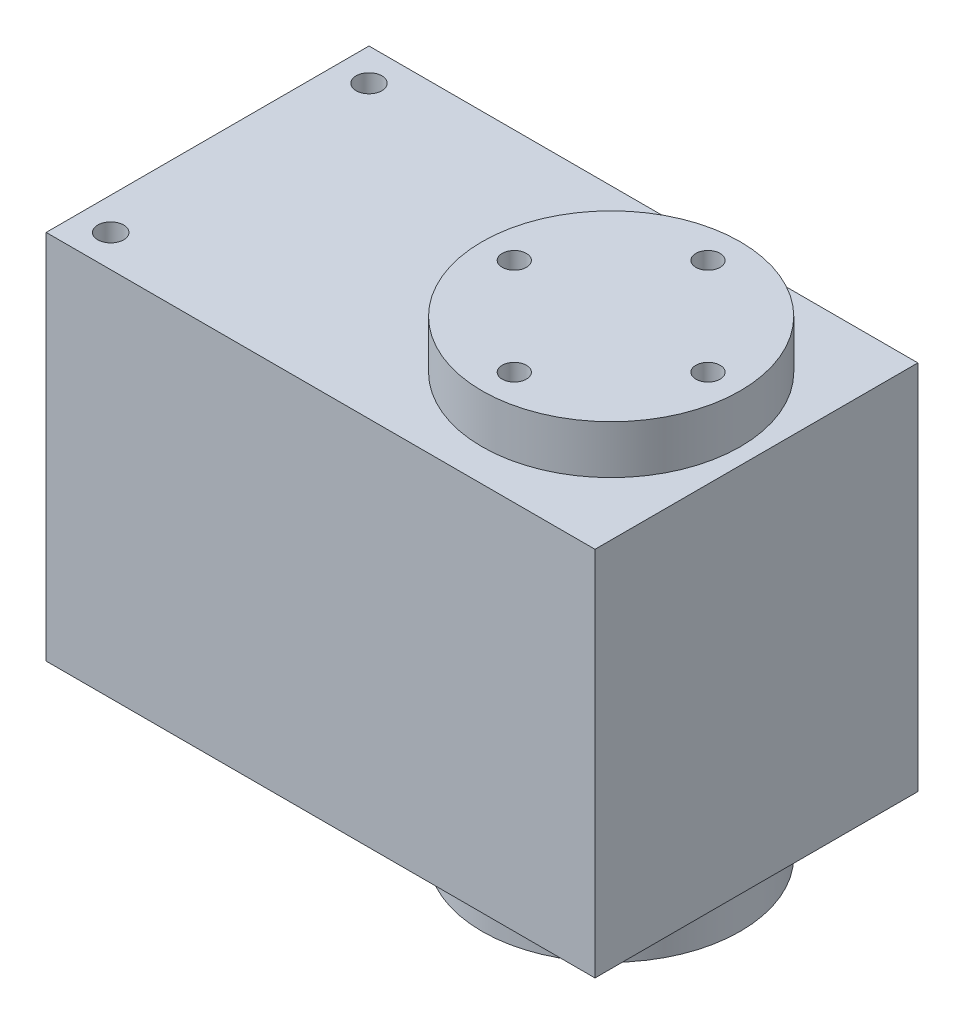
ISO-10303-21;
HEADER;
FILE_DESCRIPTION(('STEP AP214'),'2;1');
FILE_NAME('part.step','',(''),(''),'','','');
FILE_SCHEMA(('AUTOMOTIVE_DESIGN { 1 0 10303 214 1 1 1 1 }'));
ENDSEC;
DATA;
#1=APPLICATION_CONTEXT('core data for automotive mechanical design processes');
#2=APPLICATION_PROTOCOL_DEFINITION('international standard','automotive_design',2000,#1);
#3=PRODUCT_CONTEXT('',#1,'mechanical');
#4=PRODUCT('Part','Part','',(#3));
#5=PRODUCT_RELATED_PRODUCT_CATEGORY('part','',(#4));
#6=PRODUCT_DEFINITION_FORMATION('','',#4);
#7=PRODUCT_DEFINITION_CONTEXT('part definition',#1,'design');
#8=PRODUCT_DEFINITION('design','',#6,#7);
#9=PRODUCT_DEFINITION_SHAPE('','',#8);
#10=(LENGTH_UNIT() NAMED_UNIT(*) SI_UNIT(.MILLI.,.METRE.));
#11=(NAMED_UNIT(*) PLANE_ANGLE_UNIT() SI_UNIT($,.RADIAN.));
#12=(NAMED_UNIT(*) SI_UNIT($,.STERADIAN.) SOLID_ANGLE_UNIT());
#13=UNCERTAINTY_MEASURE_WITH_UNIT(LENGTH_MEASURE(1.E-05),#10,'distance_accuracy_value','');
#14=(GEOMETRIC_REPRESENTATION_CONTEXT(3) GLOBAL_UNCERTAINTY_ASSIGNED_CONTEXT((#13)) GLOBAL_UNIT_ASSIGNED_CONTEXT((#10,
#11,#12)) REPRESENTATION_CONTEXT('',''));
#15=CARTESIAN_POINT('',(0.,0.,0.));
#16=DIRECTION('',(0.,0.,1.));
#17=DIRECTION('',(1.,0.,0.));
#18=AXIS2_PLACEMENT_3D('',#15,#16,#17);
#19=CARTESIAN_POINT('',(34.,11.5,10.));
#20=DIRECTION('',(0.,-1.,0.));
#21=DIRECTION('',(0.,0.,-1.));
#22=AXIS2_PLACEMENT_3D('',#19,#20,#21);
#23=PLANE('',#22);
#24=CARTESIAN_POINT('',(25.,11.5,0.));
#25=DIRECTION('',(0.,-1.,0.));
#26=DIRECTION('',(0.,0.,-1.));
#27=AXIS2_PLACEMENT_3D('',#24,#25,#26);
#28=CIRCLE('',#27,8.);
#29=CARTESIAN_POINT('',(25.,11.5,-8.));
#30=VERTEX_POINT('',#29);
#31=EDGE_CURVE('E11',#30,#30,#28,.F.);
#32=ORIENTED_EDGE('',*,*,#31,.F.);
#33=EDGE_LOOP('',(#32));
#34=FACE_BOUND('',#33,.T.);
#35=CARTESIAN_POINT('',(2.,11.5,-8.));
#36=DIRECTION('',(0.,-1.,0.));
#37=DIRECTION('',(0.,0.,-1.));
#38=AXIS2_PLACEMENT_3D('',#35,#36,#37);
#39=CIRCLE('',#38,0.8);
#40=CARTESIAN_POINT('',(2.,11.5,-8.8));
#41=VERTEX_POINT('',#40);
#42=EDGE_CURVE('E117',#41,#41,#39,.T.);
#43=ORIENTED_EDGE('',*,*,#42,.T.);
#44=EDGE_LOOP('',(#43));
#45=FACE_BOUND('',#44,.T.);
#46=DIRECTION('',(0.,0.,1.));
#47=VECTOR('',#46,1.);
#48=CARTESIAN_POINT('',(0.,11.5,10.));
#49=LINE('',#48,#47);
#50=CARTESIAN_POINT('',(0.,11.5,-9.99999999999999));
#51=VERTEX_POINT('',#50);
#52=CARTESIAN_POINT('',(0.,11.5,10.));
#53=VERTEX_POINT('',#52);
#54=EDGE_CURVE('E96',#51,#53,#49,.T.);
#55=ORIENTED_EDGE('',*,*,#54,.T.);
#56=DIRECTION('',(-1.,0.,0.));
#57=VECTOR('',#56,1.);
#58=CARTESIAN_POINT('',(34.,11.5,10.));
#59=LINE('',#58,#57);
#60=CARTESIAN_POINT('',(34.,11.5,10.));
#61=VERTEX_POINT('',#60);
#62=EDGE_CURVE('E94',#61,#53,#59,.T.);
#63=ORIENTED_EDGE('',*,*,#62,.F.);
#64=DIRECTION('',(0.,0.,1.));
#65=VECTOR('',#64,1.);
#66=CARTESIAN_POINT('',(34.,11.5,10.));
#67=LINE('',#66,#65);
#68=CARTESIAN_POINT('',(34.,11.5,-9.99999999999999));
#69=VERTEX_POINT('',#68);
#70=EDGE_CURVE('E86',#69,#61,#67,.T.);
#71=ORIENTED_EDGE('',*,*,#70,.F.);
#72=DIRECTION('',(-1.,0.,0.));
#73=VECTOR('',#72,1.);
#74=CARTESIAN_POINT('',(34.,11.5,-9.99999999999999));
#75=LINE('',#74,#73);
#76=EDGE_CURVE('E47',#69,#51,#75,.T.);
#77=ORIENTED_EDGE('',*,*,#76,.T.);
#78=EDGE_LOOP('',(#55,#63,#71,#77));
#79=FACE_BOUND('',#78,.T.);
#80=CARTESIAN_POINT('',(2.,11.5,8.));
#81=DIRECTION('',(0.,-1.,0.));
#82=DIRECTION('',(0.,0.,-1.));
#83=AXIS2_PLACEMENT_3D('',#80,#81,#82);
#84=CIRCLE('',#83,0.8);
#85=CARTESIAN_POINT('',(2.,11.5,7.2));
#86=VERTEX_POINT('',#85);
#87=EDGE_CURVE('E108',#86,#86,#84,.F.);
#88=ORIENTED_EDGE('',*,*,#87,.F.);
#89=EDGE_LOOP('',(#88));
#90=FACE_BOUND('',#89,.T.);
#91=ADVANCED_FACE('F38',(#34,#45,#79,#90),#23,.F.);
#92=CARTESIAN_POINT('',(34.,-11.5,10.));
#93=DIRECTION('',(0.,1.,0.));
#94=DIRECTION('',(0.,0.,1.));
#95=AXIS2_PLACEMENT_3D('',#92,#93,#94);
#96=PLANE('',#95);
#97=CARTESIAN_POINT('',(25.,-11.5,0.));
#98=DIRECTION('',(0.,1.,0.));
#99=DIRECTION('',(0.,0.,1.));
#100=AXIS2_PLACEMENT_3D('',#97,#98,#99);
#101=CIRCLE('',#100,8.);
#102=CARTESIAN_POINT('',(25.,-11.5,8.));
#103=VERTEX_POINT('',#102);
#104=EDGE_CURVE('E133',#103,#103,#101,.T.);
#105=ORIENTED_EDGE('',*,*,#104,.T.);
#106=EDGE_LOOP('',(#105));
#107=FACE_BOUND('',#106,.T.);
#108=CARTESIAN_POINT('',(2.,-11.5,-8.));
#109=DIRECTION('',(0.,1.,0.));
#110=DIRECTION('',(0.,0.,1.));
#111=AXIS2_PLACEMENT_3D('',#108,#109,#110);
#112=CIRCLE('',#111,0.8);
#113=CARTESIAN_POINT('',(2.,-11.5,-7.2));
#114=VERTEX_POINT('',#113);
#115=EDGE_CURVE('E115',#114,#114,#112,.T.);
#116=ORIENTED_EDGE('',*,*,#115,.T.);
#117=EDGE_LOOP('',(#116));
#118=FACE_BOUND('',#117,.T.);
#119=DIRECTION('',(0.,0.,-1.));
#120=VECTOR('',#119,1.);
#121=CARTESIAN_POINT('',(0.,-11.5,10.));
#122=LINE('',#121,#120);
#123=CARTESIAN_POINT('',(0.,-11.5,10.));
#124=VERTEX_POINT('',#123);
#125=CARTESIAN_POINT('',(0.,-11.5,-10.));
#126=VERTEX_POINT('',#125);
#127=EDGE_CURVE('E78',#124,#126,#122,.T.);
#128=ORIENTED_EDGE('',*,*,#127,.T.);
#129=DIRECTION('',(-1.,0.,0.));
#130=VECTOR('',#129,1.);
#131=CARTESIAN_POINT('',(34.,-11.5,-10.));
#132=LINE('',#131,#130);
#133=CARTESIAN_POINT('',(34.,-11.5,-10.));
#134=VERTEX_POINT('',#133);
#135=EDGE_CURVE('E101',#134,#126,#132,.T.);
#136=ORIENTED_EDGE('',*,*,#135,.F.);
#137=DIRECTION('',(0.,0.,-1.));
#138=VECTOR('',#137,1.);
#139=CARTESIAN_POINT('',(34.,-11.5,10.));
#140=LINE('',#139,#138);
#141=CARTESIAN_POINT('',(34.,-11.5,10.));
#142=VERTEX_POINT('',#141);
#143=EDGE_CURVE('E55',#142,#134,#140,.T.);
#144=ORIENTED_EDGE('',*,*,#143,.F.);
#145=DIRECTION('',(-1.,0.,0.));
#146=VECTOR('',#145,1.);
#147=CARTESIAN_POINT('',(34.,-11.5,10.));
#148=LINE('',#147,#146);
#149=EDGE_CURVE('E97',#142,#124,#148,.T.);
#150=ORIENTED_EDGE('',*,*,#149,.T.);
#151=EDGE_LOOP('',(#128,#136,#144,#150));
#152=FACE_BOUND('',#151,.T.);
#153=CARTESIAN_POINT('',(2.,-11.5,8.));
#154=DIRECTION('',(0.,1.,0.));
#155=DIRECTION('',(0.,0.,1.));
#156=AXIS2_PLACEMENT_3D('',#153,#154,#155);
#157=CIRCLE('',#156,0.8);
#158=CARTESIAN_POINT('',(2.,-11.5,8.8));
#159=VERTEX_POINT('',#158);
#160=EDGE_CURVE('E119',#159,#159,#157,.F.);
#161=ORIENTED_EDGE('',*,*,#160,.F.);
#162=EDGE_LOOP('',(#161));
#163=FACE_BOUND('',#162,.T.);
#164=ADVANCED_FACE('F204',(#107,#118,#152,#163),#96,.F.);
#165=CARTESIAN_POINT('',(34.,11.5,-9.99999999999999));
#166=DIRECTION('',(0.,0.,1.));
#167=DIRECTION('',(0.,-1.,0.));
#168=AXIS2_PLACEMENT_3D('',#165,#166,#167);
#169=PLANE('',#168);
#170=DIRECTION('',(0.,1.,0.));
#171=VECTOR('',#170,1.);
#172=CARTESIAN_POINT('',(0.,11.5,-9.99999999999999));
#173=LINE('',#172,#171);
#174=EDGE_CURVE('E105',#126,#51,#173,.T.);
#175=ORIENTED_EDGE('',*,*,#174,.T.);
#176=ORIENTED_EDGE('',*,*,#76,.F.);
#177=DIRECTION('',(0.,1.,0.));
#178=VECTOR('',#177,1.);
#179=CARTESIAN_POINT('',(34.,11.5,-9.99999999999999));
#180=LINE('',#179,#178);
#181=EDGE_CURVE('E91',#134,#69,#180,.T.);
#182=ORIENTED_EDGE('',*,*,#181,.F.);
#183=ORIENTED_EDGE('',*,*,#135,.T.);
#184=EDGE_LOOP('',(#175,#176,#182,#183));
#185=FACE_BOUND('',#184,.T.);
#186=ADVANCED_FACE('F40',(#185),#169,.F.);
#187=CARTESIAN_POINT('',(34.,11.5,10.));
#188=DIRECTION('',(0.,0.,-1.));
#189=DIRECTION('',(0.,1.,0.));
#190=AXIS2_PLACEMENT_3D('',#187,#188,#189);
#191=PLANE('',#190);
#192=DIRECTION('',(0.,-1.,0.));
#193=VECTOR('',#192,1.);
#194=CARTESIAN_POINT('',(0.,11.5,10.));
#195=LINE('',#194,#193);
#196=EDGE_CURVE('E72',#53,#124,#195,.T.);
#197=ORIENTED_EDGE('',*,*,#196,.T.);
#198=ORIENTED_EDGE('',*,*,#149,.F.);
#199=DIRECTION('',(0.,-1.,0.));
#200=VECTOR('',#199,1.);
#201=CARTESIAN_POINT('',(34.,11.5,10.));
#202=LINE('',#201,#200);
#203=EDGE_CURVE('E89',#61,#142,#202,.T.);
#204=ORIENTED_EDGE('',*,*,#203,.F.);
#205=ORIENTED_EDGE('',*,*,#62,.T.);
#206=EDGE_LOOP('',(#197,#198,#204,#205));
#207=FACE_BOUND('',#206,.T.);
#208=ADVANCED_FACE('F99',(#207),#191,.F.);
#209=CARTESIAN_POINT('',(34.,0.,0.));
#210=DIRECTION('',(1.,0.,0.));
#211=DIRECTION('',(0.,0.,-1.));
#212=AXIS2_PLACEMENT_3D('',#209,#210,#211);
#213=PLANE('',#212);
#214=ORIENTED_EDGE('',*,*,#181,.T.);
#215=ORIENTED_EDGE('',*,*,#70,.T.);
#216=ORIENTED_EDGE('',*,*,#203,.T.);
#217=ORIENTED_EDGE('',*,*,#143,.T.);
#218=EDGE_LOOP('',(#214,#215,#216,#217));
#219=FACE_BOUND('',#218,.T.);
#220=ADVANCED_FACE('F87',(#219),#213,.T.);
#221=CARTESIAN_POINT('',(0.,0.,0.));
#222=DIRECTION('',(1.,0.,0.));
#223=DIRECTION('',(0.,0.,-1.));
#224=AXIS2_PLACEMENT_3D('',#221,#222,#223);
#225=PLANE('',#224);
#226=ORIENTED_EDGE('',*,*,#174,.F.);
#227=ORIENTED_EDGE('',*,*,#127,.F.);
#228=ORIENTED_EDGE('',*,*,#196,.F.);
#229=ORIENTED_EDGE('',*,*,#54,.F.);
#230=EDGE_LOOP('',(#226,#227,#228,#229));
#231=FACE_BOUND('',#230,.T.);
#232=ADVANCED_FACE('F215',(#231),#225,.F.);
#233=CARTESIAN_POINT('',(2.,-21.5,-8.));
#234=DIRECTION('',(0.,1.,0.));
#235=DIRECTION('',(0.,0.,1.));
#236=AXIS2_PLACEMENT_3D('',#233,#234,#235);
#237=CYLINDRICAL_SURFACE('',#236,0.8);
#238=ORIENTED_EDGE('',*,*,#115,.F.);
#239=EDGE_LOOP('',(#238));
#240=FACE_BOUND('',#239,.T.);
#241=ORIENTED_EDGE('',*,*,#42,.F.);
#242=EDGE_LOOP('',(#241));
#243=FACE_BOUND('',#242,.T.);
#244=ADVANCED_FACE('F218',(#240,#243),#237,.F.);
#245=CARTESIAN_POINT('',(2.,-21.5,8.));
#246=DIRECTION('',(0.,1.,0.));
#247=DIRECTION('',(0.,0.,1.));
#248=AXIS2_PLACEMENT_3D('',#245,#246,#247);
#249=CYLINDRICAL_SURFACE('',#248,0.8);
#250=ORIENTED_EDGE('',*,*,#160,.T.);
#251=EDGE_LOOP('',(#250));
#252=FACE_BOUND('',#251,.T.);
#253=ORIENTED_EDGE('',*,*,#87,.T.);
#254=EDGE_LOOP('',(#253));
#255=FACE_BOUND('',#254,.T.);
#256=ADVANCED_FACE('F224',(#252,#255),#249,.F.);
#257=CARTESIAN_POINT('',(25.,14.5,0.));
#258=DIRECTION('',(0.,-1.,0.));
#259=DIRECTION('',(0.,0.,-1.));
#260=AXIS2_PLACEMENT_3D('',#257,#258,#259);
#261=CYLINDRICAL_SURFACE('',#260,8.);
#262=CARTESIAN_POINT('',(25.,14.5,0.));
#263=DIRECTION('',(0.,1.,0.));
#264=DIRECTION('',(0.,0.,1.));
#265=AXIS2_PLACEMENT_3D('',#262,#263,#264);
#266=CIRCLE('',#265,8.);
#267=CARTESIAN_POINT('',(25.,14.5,8.));
#268=VERTEX_POINT('',#267);
#269=EDGE_CURVE('E118',#268,#268,#266,.T.);
#270=ORIENTED_EDGE('',*,*,#269,.F.);
#271=EDGE_LOOP('',(#270));
#272=FACE_BOUND('',#271,.T.);
#273=ORIENTED_EDGE('',*,*,#31,.T.);
#274=EDGE_LOOP('',(#273));
#275=FACE_BOUND('',#274,.T.);
#276=ADVANCED_FACE('F228',(#272,#275),#261,.T.);
#277=CARTESIAN_POINT('',(0.,14.5,0.));
#278=DIRECTION('',(0.,1.,0.));
#279=DIRECTION('',(0.,0.,1.));
#280=AXIS2_PLACEMENT_3D('',#277,#278,#279);
#281=PLANE('',#280);
#282=CARTESIAN_POINT('',(31.,14.5,0.));
#283=DIRECTION('',(0.,1.,0.));
#284=DIRECTION('',(0.,0.,1.));
#285=AXIS2_PLACEMENT_3D('',#282,#283,#284);
#286=CIRCLE('',#285,0.750000000000002);
#287=CARTESIAN_POINT('',(31.,14.5,0.750000000000065));
#288=VERTEX_POINT('',#287);
#289=EDGE_CURVE('E151',#288,#288,#286,.T.);
#290=ORIENTED_EDGE('',*,*,#289,.F.);
#291=EDGE_LOOP('',(#290));
#292=FACE_BOUND('',#291,.T.);
#293=CARTESIAN_POINT('',(25.,14.5,-6.));
#294=DIRECTION('',(0.,1.,0.));
#295=DIRECTION('',(0.,0.,1.));
#296=AXIS2_PLACEMENT_3D('',#293,#294,#295);
#297=CIRCLE('',#296,0.750000000000001);
#298=CARTESIAN_POINT('',(25.,14.5,-5.25));
#299=VERTEX_POINT('',#298);
#300=EDGE_CURVE('E158',#299,#299,#297,.T.);
#301=ORIENTED_EDGE('',*,*,#300,.F.);
#302=EDGE_LOOP('',(#301));
#303=FACE_BOUND('',#302,.T.);
#304=CARTESIAN_POINT('',(19.,14.5,0.));
#305=DIRECTION('',(0.,1.,0.));
#306=DIRECTION('',(0.,0.,1.));
#307=AXIS2_PLACEMENT_3D('',#304,#305,#306);
#308=CIRCLE('',#307,0.750000000000001);
#309=CARTESIAN_POINT('',(19.,14.5,0.74999999999998));
#310=VERTEX_POINT('',#309);
#311=EDGE_CURVE('E139',#310,#310,#308,.T.);
#312=ORIENTED_EDGE('',*,*,#311,.F.);
#313=EDGE_LOOP('',(#312));
#314=FACE_BOUND('',#313,.T.);
#315=CARTESIAN_POINT('',(25.,14.5,6.));
#316=DIRECTION('',(0.,1.,0.));
#317=DIRECTION('',(0.,0.,1.));
#318=AXIS2_PLACEMENT_3D('',#315,#316,#317);
#319=CIRCLE('',#318,0.750000000000002);
#320=CARTESIAN_POINT('',(25.,14.5,6.75));
#321=VERTEX_POINT('',#320);
#322=EDGE_CURVE('E146',#321,#321,#319,.T.);
#323=ORIENTED_EDGE('',*,*,#322,.F.);
#324=EDGE_LOOP('',(#323));
#325=FACE_BOUND('',#324,.T.);
#326=ORIENTED_EDGE('',*,*,#269,.T.);
#327=EDGE_LOOP('',(#326));
#328=FACE_BOUND('',#327,.T.);
#329=ADVANCED_FACE('F231',(#292,#303,#314,#325,#328),#281,.T.);
#330=CARTESIAN_POINT('',(25.,-14.5,0.));
#331=DIRECTION('',(0.,1.,0.));
#332=DIRECTION('',(0.,0.,1.));
#333=AXIS2_PLACEMENT_3D('',#330,#331,#332);
#334=CYLINDRICAL_SURFACE('',#333,8.);
#335=CARTESIAN_POINT('',(25.,-14.5,0.));
#336=DIRECTION('',(0.,1.,0.));
#337=DIRECTION('',(0.,0.,1.));
#338=AXIS2_PLACEMENT_3D('',#335,#336,#337);
#339=CIRCLE('',#338,8.);
#340=CARTESIAN_POINT('',(25.,-14.5,8.));
#341=VERTEX_POINT('',#340);
#342=EDGE_CURVE('E132',#341,#341,#339,.T.);
#343=ORIENTED_EDGE('',*,*,#342,.T.);
#344=EDGE_LOOP('',(#343));
#345=FACE_BOUND('',#344,.T.);
#346=ORIENTED_EDGE('',*,*,#104,.F.);
#347=EDGE_LOOP('',(#346));
#348=FACE_BOUND('',#347,.T.);
#349=ADVANCED_FACE('F235',(#345,#348),#334,.T.);
#350=CARTESIAN_POINT('',(0.,-14.5,0.));
#351=DIRECTION('',(0.,-1.,0.));
#352=DIRECTION('',(0.,0.,1.));
#353=AXIS2_PLACEMENT_3D('',#350,#351,#352);
#354=PLANE('',#353);
#355=CARTESIAN_POINT('',(31.,-14.5,0.));
#356=DIRECTION('',(0.,1.,0.));
#357=DIRECTION('',(0.,0.,1.));
#358=AXIS2_PLACEMENT_3D('',#355,#356,#357);
#359=CIRCLE('',#358,0.750000000000002);
#360=CARTESIAN_POINT('',(31.,-14.5,0.750000000000065));
#361=VERTEX_POINT('',#360);
#362=EDGE_CURVE('E175',#361,#361,#359,.T.);
#363=ORIENTED_EDGE('',*,*,#362,.T.);
#364=EDGE_LOOP('',(#363));
#365=FACE_BOUND('',#364,.T.);
#366=CARTESIAN_POINT('',(25.,-14.5,-6.));
#367=DIRECTION('',(0.,1.,0.));
#368=DIRECTION('',(0.,0.,1.));
#369=AXIS2_PLACEMENT_3D('',#366,#367,#368);
#370=CIRCLE('',#369,0.750000000000001);
#371=CARTESIAN_POINT('',(25.,-14.5,-5.25));
#372=VERTEX_POINT('',#371);
#373=EDGE_CURVE('E181',#372,#372,#370,.T.);
#374=ORIENTED_EDGE('',*,*,#373,.T.);
#375=EDGE_LOOP('',(#374));
#376=FACE_BOUND('',#375,.T.);
#377=CARTESIAN_POINT('',(19.,-14.5,0.));
#378=DIRECTION('',(0.,1.,0.));
#379=DIRECTION('',(0.,0.,1.));
#380=AXIS2_PLACEMENT_3D('',#377,#378,#379);
#381=CIRCLE('',#380,0.750000000000001);
#382=CARTESIAN_POINT('',(19.,-14.5,0.74999999999998));
#383=VERTEX_POINT('',#382);
#384=EDGE_CURVE('E163',#383,#383,#381,.T.);
#385=ORIENTED_EDGE('',*,*,#384,.T.);
#386=EDGE_LOOP('',(#385));
#387=FACE_BOUND('',#386,.T.);
#388=CARTESIAN_POINT('',(25.,-14.5,6.));
#389=DIRECTION('',(0.,1.,0.));
#390=DIRECTION('',(0.,0.,1.));
#391=AXIS2_PLACEMENT_3D('',#388,#389,#390);
#392=CIRCLE('',#391,0.750000000000002);
#393=CARTESIAN_POINT('',(25.,-14.5,6.75));
#394=VERTEX_POINT('',#393);
#395=EDGE_CURVE('E170',#394,#394,#392,.T.);
#396=ORIENTED_EDGE('',*,*,#395,.T.);
#397=EDGE_LOOP('',(#396));
#398=FACE_BOUND('',#397,.T.);
#399=ORIENTED_EDGE('',*,*,#342,.F.);
#400=EDGE_LOOP('',(#399));
#401=FACE_BOUND('',#400,.T.);
#402=ADVANCED_FACE('F239',(#365,#376,#387,#398,#401),#354,.T.);
#403=CARTESIAN_POINT('',(25.,11.5,6.));
#404=DIRECTION('',(0.,1.,0.));
#405=DIRECTION('',(0.,0.,1.));
#406=AXIS2_PLACEMENT_3D('',#403,#404,#405);
#407=CYLINDRICAL_SURFACE('',#406,0.750000000000002);
#408=CARTESIAN_POINT('',(25.,11.5,6.));
#409=DIRECTION('',(0.,1.,0.));
#410=DIRECTION('',(0.,0.,1.));
#411=AXIS2_PLACEMENT_3D('',#408,#409,#410);
#412=CIRCLE('',#411,0.750000000000002);
#413=CARTESIAN_POINT('',(25.,11.5,6.75));
#414=VERTEX_POINT('',#413);
#415=EDGE_CURVE('E136',#414,#414,#412,.T.);
#416=ORIENTED_EDGE('',*,*,#415,.F.);
#417=EDGE_LOOP('',(#416));
#418=FACE_BOUND('',#417,.T.);
#419=ORIENTED_EDGE('',*,*,#322,.T.);
#420=EDGE_LOOP('',(#419));
#421=FACE_BOUND('',#420,.T.);
#422=ADVANCED_FACE('F243',(#418,#421),#407,.F.);
#423=CARTESIAN_POINT('',(25.,11.5,6.));
#424=DIRECTION('',(0.,1.,0.));
#425=DIRECTION('',(0.,0.,1.));
#426=AXIS2_PLACEMENT_3D('',#423,#424,#425);
#427=PLANE('',#426);
#428=ORIENTED_EDGE('',*,*,#415,.T.);
#429=EDGE_LOOP('',(#428));
#430=FACE_BOUND('',#429,.T.);
#431=ADVANCED_FACE('F249',(#430),#427,.T.);
#432=CARTESIAN_POINT('',(19.,11.5,0.));
#433=DIRECTION('',(0.,1.,0.));
#434=DIRECTION('',(0.,0.,1.));
#435=AXIS2_PLACEMENT_3D('',#432,#433,#434);
#436=CYLINDRICAL_SURFACE('',#435,0.750000000000001);
#437=CARTESIAN_POINT('',(19.,11.5,0.));
#438=DIRECTION('',(0.,1.,0.));
#439=DIRECTION('',(0.,0.,1.));
#440=AXIS2_PLACEMENT_3D('',#437,#438,#439);
#441=CIRCLE('',#440,0.750000000000001);
#442=CARTESIAN_POINT('',(19.,11.5,0.74999999999998));
#443=VERTEX_POINT('',#442);
#444=EDGE_CURVE('E142',#443,#443,#441,.T.);
#445=ORIENTED_EDGE('',*,*,#444,.F.);
#446=EDGE_LOOP('',(#445));
#447=FACE_BOUND('',#446,.T.);
#448=ORIENTED_EDGE('',*,*,#311,.T.);
#449=EDGE_LOOP('',(#448));
#450=FACE_BOUND('',#449,.T.);
#451=ADVANCED_FACE('F245',(#447,#450),#436,.F.);
#452=CARTESIAN_POINT('',(19.,11.5,0.));
#453=DIRECTION('',(0.,1.,0.));
#454=DIRECTION('',(0.,0.,1.));
#455=AXIS2_PLACEMENT_3D('',#452,#453,#454);
#456=PLANE('',#455);
#457=ORIENTED_EDGE('',*,*,#444,.T.);
#458=EDGE_LOOP('',(#457));
#459=FACE_BOUND('',#458,.T.);
#460=ADVANCED_FACE('F248',(#459),#456,.T.);
#461=CARTESIAN_POINT('',(25.,11.5,-6.));
#462=DIRECTION('',(0.,1.,0.));
#463=DIRECTION('',(0.,0.,1.));
#464=AXIS2_PLACEMENT_3D('',#461,#462,#463);
#465=CYLINDRICAL_SURFACE('',#464,0.750000000000001);
#466=CARTESIAN_POINT('',(25.,11.5,-6.));
#467=DIRECTION('',(0.,1.,0.));
#468=DIRECTION('',(0.,0.,1.));
#469=AXIS2_PLACEMENT_3D('',#466,#467,#468);
#470=CIRCLE('',#469,0.750000000000001);
#471=CARTESIAN_POINT('',(25.,11.5,-5.25));
#472=VERTEX_POINT('',#471);
#473=EDGE_CURVE('E143',#472,#472,#470,.T.);
#474=ORIENTED_EDGE('',*,*,#473,.F.);
#475=EDGE_LOOP('',(#474));
#476=FACE_BOUND('',#475,.T.);
#477=ORIENTED_EDGE('',*,*,#300,.T.);
#478=EDGE_LOOP('',(#477));
#479=FACE_BOUND('',#478,.T.);
#480=ADVANCED_FACE('F253',(#476,#479),#465,.F.);
#481=CARTESIAN_POINT('',(25.,11.5,-6.));
#482=DIRECTION('',(0.,1.,0.));
#483=DIRECTION('',(0.,0.,1.));
#484=AXIS2_PLACEMENT_3D('',#481,#482,#483);
#485=PLANE('',#484);
#486=ORIENTED_EDGE('',*,*,#473,.T.);
#487=EDGE_LOOP('',(#486));
#488=FACE_BOUND('',#487,.T.);
#489=ADVANCED_FACE('F265',(#488),#485,.T.);
#490=CARTESIAN_POINT('',(31.,11.5,0.));
#491=DIRECTION('',(0.,1.,0.));
#492=DIRECTION('',(0.,0.,1.));
#493=AXIS2_PLACEMENT_3D('',#490,#491,#492);
#494=CYLINDRICAL_SURFACE('',#493,0.750000000000002);
#495=CARTESIAN_POINT('',(31.,11.5,0.));
#496=DIRECTION('',(0.,1.,0.));
#497=DIRECTION('',(0.,0.,1.));
#498=AXIS2_PLACEMENT_3D('',#495,#496,#497);
#499=CIRCLE('',#498,0.750000000000002);
#500=CARTESIAN_POINT('',(31.,11.5,0.750000000000065));
#501=VERTEX_POINT('',#500);
#502=EDGE_CURVE('E154',#501,#501,#499,.T.);
#503=ORIENTED_EDGE('',*,*,#502,.F.);
#504=EDGE_LOOP('',(#503));
#505=FACE_BOUND('',#504,.T.);
#506=ORIENTED_EDGE('',*,*,#289,.T.);
#507=EDGE_LOOP('',(#506));
#508=FACE_BOUND('',#507,.T.);
#509=ADVANCED_FACE('F261',(#505,#508),#494,.F.);
#510=CARTESIAN_POINT('',(31.,11.5,0.));
#511=DIRECTION('',(0.,1.,0.));
#512=DIRECTION('',(0.,0.,1.));
#513=AXIS2_PLACEMENT_3D('',#510,#511,#512);
#514=PLANE('',#513);
#515=ORIENTED_EDGE('',*,*,#502,.T.);
#516=EDGE_LOOP('',(#515));
#517=FACE_BOUND('',#516,.T.);
#518=ADVANCED_FACE('F264',(#517),#514,.T.);
#519=CARTESIAN_POINT('',(25.,-11.5,6.));
#520=DIRECTION('',(0.,-1.,0.));
#521=DIRECTION('',(0.,0.,-1.));
#522=AXIS2_PLACEMENT_3D('',#519,#520,#521);
#523=CYLINDRICAL_SURFACE('',#522,0.750000000000002);
#524=CARTESIAN_POINT('',(25.,-11.5,6.));
#525=DIRECTION('',(0.,1.,0.));
#526=DIRECTION('',(0.,0.,1.));
#527=AXIS2_PLACEMENT_3D('',#524,#525,#526);
#528=CIRCLE('',#527,0.750000000000002);
#529=CARTESIAN_POINT('',(25.,-11.5,6.75));
#530=VERTEX_POINT('',#529);
#531=EDGE_CURVE('E155',#530,#530,#528,.T.);
#532=ORIENTED_EDGE('',*,*,#531,.T.);
#533=EDGE_LOOP('',(#532));
#534=FACE_BOUND('',#533,.T.);
#535=ORIENTED_EDGE('',*,*,#395,.F.);
#536=EDGE_LOOP('',(#535));
#537=FACE_BOUND('',#536,.T.);
#538=ADVANCED_FACE('F269',(#534,#537),#523,.F.);
#539=CARTESIAN_POINT('',(25.,-11.5,6.));
#540=DIRECTION('',(0.,-1.,0.));
#541=DIRECTION('',(0.,0.,1.));
#542=AXIS2_PLACEMENT_3D('',#539,#540,#541);
#543=PLANE('',#542);
#544=ORIENTED_EDGE('',*,*,#531,.F.);
#545=EDGE_LOOP('',(#544));
#546=FACE_BOUND('',#545,.T.);
#547=ADVANCED_FACE('F280',(#546),#543,.T.);
#548=CARTESIAN_POINT('',(19.,-11.5,0.));
#549=DIRECTION('',(0.,-1.,0.));
#550=DIRECTION('',(0.,0.,-1.));
#551=AXIS2_PLACEMENT_3D('',#548,#549,#550);
#552=CYLINDRICAL_SURFACE('',#551,0.750000000000001);
#553=CARTESIAN_POINT('',(19.,-11.5,0.));
#554=DIRECTION('',(0.,1.,0.));
#555=DIRECTION('',(0.,0.,1.));
#556=AXIS2_PLACEMENT_3D('',#553,#554,#555);
#557=CIRCLE('',#556,0.750000000000001);
#558=CARTESIAN_POINT('',(19.,-11.5,0.74999999999998));
#559=VERTEX_POINT('',#558);
#560=EDGE_CURVE('E166',#559,#559,#557,.T.);
#561=ORIENTED_EDGE('',*,*,#560,.T.);
#562=EDGE_LOOP('',(#561));
#563=FACE_BOUND('',#562,.T.);
#564=ORIENTED_EDGE('',*,*,#384,.F.);
#565=EDGE_LOOP('',(#564));
#566=FACE_BOUND('',#565,.T.);
#567=ADVANCED_FACE('F277',(#563,#566),#552,.F.);
#568=CARTESIAN_POINT('',(19.,-11.5,0.));
#569=DIRECTION('',(0.,-1.,0.));
#570=DIRECTION('',(0.,0.,1.));
#571=AXIS2_PLACEMENT_3D('',#568,#569,#570);
#572=PLANE('',#571);
#573=ORIENTED_EDGE('',*,*,#560,.F.);
#574=EDGE_LOOP('',(#573));
#575=FACE_BOUND('',#574,.T.);
#576=ADVANCED_FACE('F201',(#575),#572,.T.);
#577=CARTESIAN_POINT('',(25.,-11.5,-6.));
#578=DIRECTION('',(0.,-1.,0.));
#579=DIRECTION('',(0.,0.,-1.));
#580=AXIS2_PLACEMENT_3D('',#577,#578,#579);
#581=CYLINDRICAL_SURFACE('',#580,0.750000000000001);
#582=CARTESIAN_POINT('',(25.,-11.5,-6.));
#583=DIRECTION('',(0.,1.,0.));
#584=DIRECTION('',(0.,0.,1.));
#585=AXIS2_PLACEMENT_3D('',#582,#583,#584);
#586=CIRCLE('',#585,0.750000000000001);
#587=CARTESIAN_POINT('',(25.,-11.5,-5.25));
#588=VERTEX_POINT('',#587);
#589=EDGE_CURVE('E167',#588,#588,#586,.T.);
#590=ORIENTED_EDGE('',*,*,#589,.T.);
#591=EDGE_LOOP('',(#590));
#592=FACE_BOUND('',#591,.T.);
#593=ORIENTED_EDGE('',*,*,#373,.F.);
#594=EDGE_LOOP('',(#593));
#595=FACE_BOUND('',#594,.T.);
#596=ADVANCED_FACE('F187',(#592,#595),#581,.F.);
#597=CARTESIAN_POINT('',(25.,-11.5,-6.));
#598=DIRECTION('',(0.,-1.,0.));
#599=DIRECTION('',(0.,0.,1.));
#600=AXIS2_PLACEMENT_3D('',#597,#598,#599);
#601=PLANE('',#600);
#602=ORIENTED_EDGE('',*,*,#589,.F.);
#603=EDGE_LOOP('',(#602));
#604=FACE_BOUND('',#603,.T.);
#605=ADVANCED_FACE('F190',(#604),#601,.T.);
#606=CARTESIAN_POINT('',(31.,-11.5,0.));
#607=DIRECTION('',(0.,-1.,0.));
#608=DIRECTION('',(0.,0.,-1.));
#609=AXIS2_PLACEMENT_3D('',#606,#607,#608);
#610=CYLINDRICAL_SURFACE('',#609,0.750000000000002);
#611=CARTESIAN_POINT('',(31.,-11.5,0.));
#612=DIRECTION('',(0.,1.,0.));
#613=DIRECTION('',(0.,0.,1.));
#614=AXIS2_PLACEMENT_3D('',#611,#612,#613);
#615=CIRCLE('',#614,0.750000000000002);
#616=CARTESIAN_POINT('',(31.,-11.5,0.750000000000065));
#617=VERTEX_POINT('',#616);
#618=EDGE_CURVE('E178',#617,#617,#615,.T.);
#619=ORIENTED_EDGE('',*,*,#618,.T.);
#620=EDGE_LOOP('',(#619));
#621=FACE_BOUND('',#620,.T.);
#622=ORIENTED_EDGE('',*,*,#362,.F.);
#623=EDGE_LOOP('',(#622));
#624=FACE_BOUND('',#623,.T.);
#625=ADVANCED_FACE('F192',(#621,#624),#610,.F.);
#626=CARTESIAN_POINT('',(31.,-11.5,0.));
#627=DIRECTION('',(0.,-1.,0.));
#628=DIRECTION('',(0.,0.,1.));
#629=AXIS2_PLACEMENT_3D('',#626,#627,#628);
#630=PLANE('',#629);
#631=ORIENTED_EDGE('',*,*,#618,.F.);
#632=EDGE_LOOP('',(#631));
#633=FACE_BOUND('',#632,.T.);
#634=ADVANCED_FACE('F198',(#633),#630,.T.);
#635=CLOSED_SHELL('',(#91,#164,#186,#208,#220,#232,#244,#256,#276,#329,#349,#402,#422,#431,#451,
#460,#480,#489,#509,#518,#538,#547,#567,#576,#596,#605,#625,#634));
#636=MANIFOLD_SOLID_BREP('B2',#635);
#637=ADVANCED_BREP_SHAPE_REPRESENTATION('',(#18,#636),#14);
#638=SHAPE_DEFINITION_REPRESENTATION(#9,#637);
ENDSEC;
END-ISO-10303-21;
